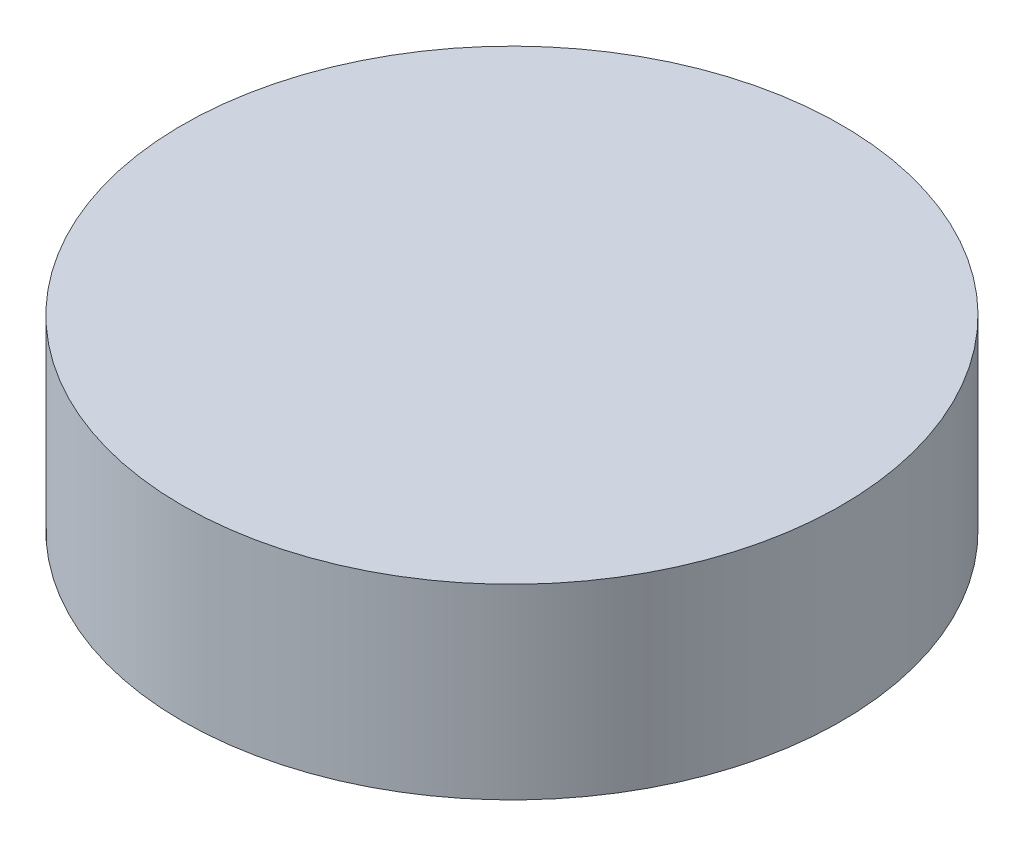
ISO-10303-21;
HEADER;
FILE_DESCRIPTION(('STEP AP214'),'2;1');
FILE_NAME('part.step','',(''),(''),'','','');
FILE_SCHEMA(('AUTOMOTIVE_DESIGN { 1 0 10303 214 1 1 1 1 }'));
ENDSEC;
DATA;
#1=APPLICATION_CONTEXT('core data for automotive mechanical design processes');
#2=APPLICATION_PROTOCOL_DEFINITION('international standard','automotive_design',2000,#1);
#3=PRODUCT_CONTEXT('',#1,'mechanical');
#4=PRODUCT('Part','Part','',(#3));
#5=PRODUCT_RELATED_PRODUCT_CATEGORY('part','',(#4));
#6=PRODUCT_DEFINITION_FORMATION('','',#4);
#7=PRODUCT_DEFINITION_CONTEXT('part definition',#1,'design');
#8=PRODUCT_DEFINITION('design','',#6,#7);
#9=PRODUCT_DEFINITION_SHAPE('','',#8);
#10=(LENGTH_UNIT() NAMED_UNIT(*) SI_UNIT(.MILLI.,.METRE.));
#11=(NAMED_UNIT(*) PLANE_ANGLE_UNIT() SI_UNIT($,.RADIAN.));
#12=(NAMED_UNIT(*) SI_UNIT($,.STERADIAN.) SOLID_ANGLE_UNIT());
#13=UNCERTAINTY_MEASURE_WITH_UNIT(LENGTH_MEASURE(1.E-05),#10,'distance_accuracy_value','');
#14=(GEOMETRIC_REPRESENTATION_CONTEXT(3) GLOBAL_UNCERTAINTY_ASSIGNED_CONTEXT((#13)) GLOBAL_UNIT_ASSIGNED_CONTEXT((#10,
#11,#12)) REPRESENTATION_CONTEXT('',''));
#15=CARTESIAN_POINT('',(0.,0.,0.));
#16=DIRECTION('',(0.,0.,1.));
#17=DIRECTION('',(1.,0.,0.));
#18=AXIS2_PLACEMENT_3D('',#15,#16,#17);
#19=CARTESIAN_POINT('',(0.,8.5,0.));
#20=DIRECTION('',(0.,-1.,0.));
#21=DIRECTION('',(0.,0.,-1.));
#22=AXIS2_PLACEMENT_3D('',#19,#20,#21);
#23=CYLINDRICAL_SURFACE('',#22,15.);
#24=CARTESIAN_POINT('',(0.,8.5,0.));
#25=DIRECTION('',(0.,1.,0.));
#26=DIRECTION('',(0.,0.,1.));
#27=AXIS2_PLACEMENT_3D('',#24,#25,#26);
#28=CIRCLE('',#27,15.);
#29=CARTESIAN_POINT('',(0.,8.5,15.));
#30=VERTEX_POINT('',#29);
#31=EDGE_CURVE('E10',#30,#30,#28,.T.);
#32=ORIENTED_EDGE('',*,*,#31,.F.);
#33=EDGE_LOOP('',(#32));
#34=FACE_BOUND('',#33,.T.);
#35=CARTESIAN_POINT('',(0.,0.,0.));
#36=DIRECTION('',(0.,1.,0.));
#37=DIRECTION('',(0.,0.,1.));
#38=AXIS2_PLACEMENT_3D('',#35,#36,#37);
#39=CIRCLE('',#38,15.);
#40=CARTESIAN_POINT('',(0.,0.,15.));
#41=VERTEX_POINT('',#40);
#42=EDGE_CURVE('E42',#41,#41,#39,.T.);
#43=ORIENTED_EDGE('',*,*,#42,.T.);
#44=EDGE_LOOP('',(#43));
#45=FACE_BOUND('',#44,.T.);
#46=ADVANCED_FACE('F39',(#34,#45),#23,.T.);
#47=CARTESIAN_POINT('',(0.,8.5,0.));
#48=DIRECTION('',(0.,1.,0.));
#49=DIRECTION('',(0.,0.,1.));
#50=AXIS2_PLACEMENT_3D('',#47,#48,#49);
#51=PLANE('',#50);
#52=ORIENTED_EDGE('',*,*,#31,.T.);
#53=EDGE_LOOP('',(#52));
#54=FACE_BOUND('',#53,.T.);
#55=ADVANCED_FACE('F54',(#54),#51,.T.);
#56=CARTESIAN_POINT('',(0.,0.,0.));
#57=DIRECTION('',(0.,1.,0.));
#58=DIRECTION('',(0.,0.,1.));
#59=AXIS2_PLACEMENT_3D('',#56,#57,#58);
#60=PLANE('',#59);
#61=ORIENTED_EDGE('',*,*,#42,.F.);
#62=EDGE_LOOP('',(#61));
#63=FACE_BOUND('',#62,.T.);
#64=ADVANCED_FACE('F52',(#63),#60,.F.);
#65=CLOSED_SHELL('',(#46,#55,#64));
#66=MANIFOLD_SOLID_BREP('B2',#65);
#67=ADVANCED_BREP_SHAPE_REPRESENTATION('',(#18,#66),#14);
#68=SHAPE_DEFINITION_REPRESENTATION(#9,#67);
ENDSEC;
END-ISO-10303-21;
